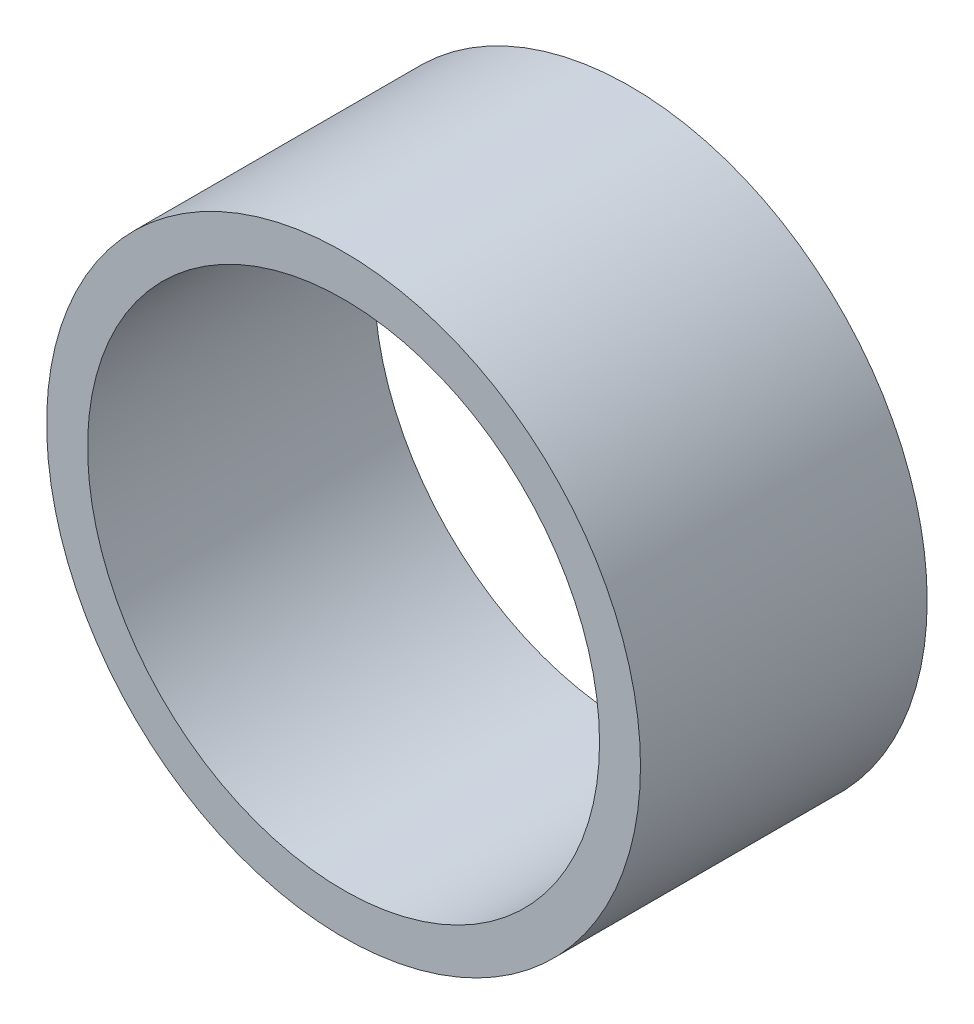
ISO-10303-21;
HEADER;
FILE_DESCRIPTION(('STEP AP214'),'2;1');
FILE_NAME('part.step','',(''),(''),'','','');
FILE_SCHEMA(('AUTOMOTIVE_DESIGN { 1 0 10303 214 1 1 1 1 }'));
ENDSEC;
DATA;
#1=APPLICATION_CONTEXT('core data for automotive mechanical design processes');
#2=APPLICATION_PROTOCOL_DEFINITION('international standard','automotive_design',2000,#1);
#3=PRODUCT_CONTEXT('',#1,'mechanical');
#4=PRODUCT('Part','Part','',(#3));
#5=PRODUCT_RELATED_PRODUCT_CATEGORY('part','',(#4));
#6=PRODUCT_DEFINITION_FORMATION('','',#4);
#7=PRODUCT_DEFINITION_CONTEXT('part definition',#1,'design');
#8=PRODUCT_DEFINITION('design','',#6,#7);
#9=PRODUCT_DEFINITION_SHAPE('','',#8);
#10=(LENGTH_UNIT() NAMED_UNIT(*) SI_UNIT(.MILLI.,.METRE.));
#11=(NAMED_UNIT(*) PLANE_ANGLE_UNIT() SI_UNIT($,.RADIAN.));
#12=(NAMED_UNIT(*) SI_UNIT($,.STERADIAN.) SOLID_ANGLE_UNIT());
#13=UNCERTAINTY_MEASURE_WITH_UNIT(LENGTH_MEASURE(1.E-05),#10,'distance_accuracy_value','');
#14=(GEOMETRIC_REPRESENTATION_CONTEXT(3) GLOBAL_UNCERTAINTY_ASSIGNED_CONTEXT((#13)) GLOBAL_UNIT_ASSIGNED_CONTEXT((#10,
#11,#12)) REPRESENTATION_CONTEXT('',''));
#15=CARTESIAN_POINT('',(0.,0.,0.));
#16=DIRECTION('',(0.,0.,1.));
#17=DIRECTION('',(1.,0.,0.));
#18=AXIS2_PLACEMENT_3D('',#15,#16,#17);
#19=CARTESIAN_POINT('',(0.,0.,3.5));
#20=DIRECTION('',(0.,0.,1.));
#21=DIRECTION('',(1.,0.,0.));
#22=AXIS2_PLACEMENT_3D('',#19,#20,#21);
#23=PLANE('',#22);
#24=CARTESIAN_POINT('',(0.,0.,3.5));
#25=DIRECTION('',(0.,0.,1.));
#26=DIRECTION('',(1.,0.,0.));
#27=AXIS2_PLACEMENT_3D('',#24,#25,#26);
#28=CIRCLE('',#27,3.625);
#29=CARTESIAN_POINT('',(3.625,0.,3.5));
#30=VERTEX_POINT('',#29);
#31=EDGE_CURVE('E10',#30,#30,#28,.T.);
#32=ORIENTED_EDGE('',*,*,#31,.T.);
#33=EDGE_LOOP('',(#32));
#34=FACE_BOUND('',#33,.T.);
#35=CARTESIAN_POINT('',(0.,0.,3.5));
#36=DIRECTION('',(0.,0.,1.));
#37=DIRECTION('',(1.,0.,0.));
#38=AXIS2_PLACEMENT_3D('',#35,#36,#37);
#39=CIRCLE('',#38,3.125);
#40=CARTESIAN_POINT('',(3.125,0.,3.5));
#41=VERTEX_POINT('',#40);
#42=EDGE_CURVE('E48',#41,#41,#39,.T.);
#43=ORIENTED_EDGE('',*,*,#42,.F.);
#44=EDGE_LOOP('',(#43));
#45=FACE_BOUND('',#44,.T.);
#46=ADVANCED_FACE('F37',(#34,#45),#23,.T.);
#47=CARTESIAN_POINT('',(0.,0.,0.));
#48=DIRECTION('',(0.,0.,1.));
#49=DIRECTION('',(1.,0.,0.));
#50=AXIS2_PLACEMENT_3D('',#47,#48,#49);
#51=PLANE('',#50);
#52=CARTESIAN_POINT('',(0.,0.,0.));
#53=DIRECTION('',(0.,0.,1.));
#54=DIRECTION('',(1.,0.,0.));
#55=AXIS2_PLACEMENT_3D('',#52,#53,#54);
#56=CIRCLE('',#55,3.625);
#57=CARTESIAN_POINT('',(3.625,0.,0.));
#58=VERTEX_POINT('',#57);
#59=EDGE_CURVE('E41',#58,#58,#56,.T.);
#60=ORIENTED_EDGE('',*,*,#59,.F.);
#61=EDGE_LOOP('',(#60));
#62=FACE_BOUND('',#61,.T.);
#63=CARTESIAN_POINT('',(0.,0.,0.));
#64=DIRECTION('',(0.,0.,1.));
#65=DIRECTION('',(1.,0.,0.));
#66=AXIS2_PLACEMENT_3D('',#63,#64,#65);
#67=CIRCLE('',#66,3.125);
#68=CARTESIAN_POINT('',(3.125,0.,0.));
#69=VERTEX_POINT('',#68);
#70=EDGE_CURVE('E50',#69,#69,#67,.T.);
#71=ORIENTED_EDGE('',*,*,#70,.T.);
#72=EDGE_LOOP('',(#71));
#73=FACE_BOUND('',#72,.T.);
#74=ADVANCED_FACE('F60',(#62,#73),#51,.F.);
#75=CARTESIAN_POINT('',(0.,0.,3.5));
#76=DIRECTION('',(0.,0.,-1.));
#77=DIRECTION('',(-1.,0.,0.));
#78=AXIS2_PLACEMENT_3D('',#75,#76,#77);
#79=CYLINDRICAL_SURFACE('',#78,3.625);
#80=ORIENTED_EDGE('',*,*,#31,.F.);
#81=EDGE_LOOP('',(#80));
#82=FACE_BOUND('',#81,.T.);
#83=ORIENTED_EDGE('',*,*,#59,.T.);
#84=EDGE_LOOP('',(#83));
#85=FACE_BOUND('',#84,.T.);
#86=ADVANCED_FACE('F39',(#82,#85),#79,.T.);
#87=CARTESIAN_POINT('',(0.,0.,3.5));
#88=DIRECTION('',(0.,0.,-1.));
#89=DIRECTION('',(-1.,0.,0.));
#90=AXIS2_PLACEMENT_3D('',#87,#88,#89);
#91=CYLINDRICAL_SURFACE('',#90,3.125);
#92=ORIENTED_EDGE('',*,*,#42,.T.);
#93=EDGE_LOOP('',(#92));
#94=FACE_BOUND('',#93,.T.);
#95=ORIENTED_EDGE('',*,*,#70,.F.);
#96=EDGE_LOOP('',(#95));
#97=FACE_BOUND('',#96,.T.);
#98=ADVANCED_FACE('F56',(#94,#97),#91,.F.);
#99=CLOSED_SHELL('',(#46,#74,#86,#98));
#100=MANIFOLD_SOLID_BREP('B2',#99);
#101=ADVANCED_BREP_SHAPE_REPRESENTATION('',(#18,#100),#14);
#102=SHAPE_DEFINITION_REPRESENTATION(#9,#101);
ENDSEC;
END-ISO-10303-21;
